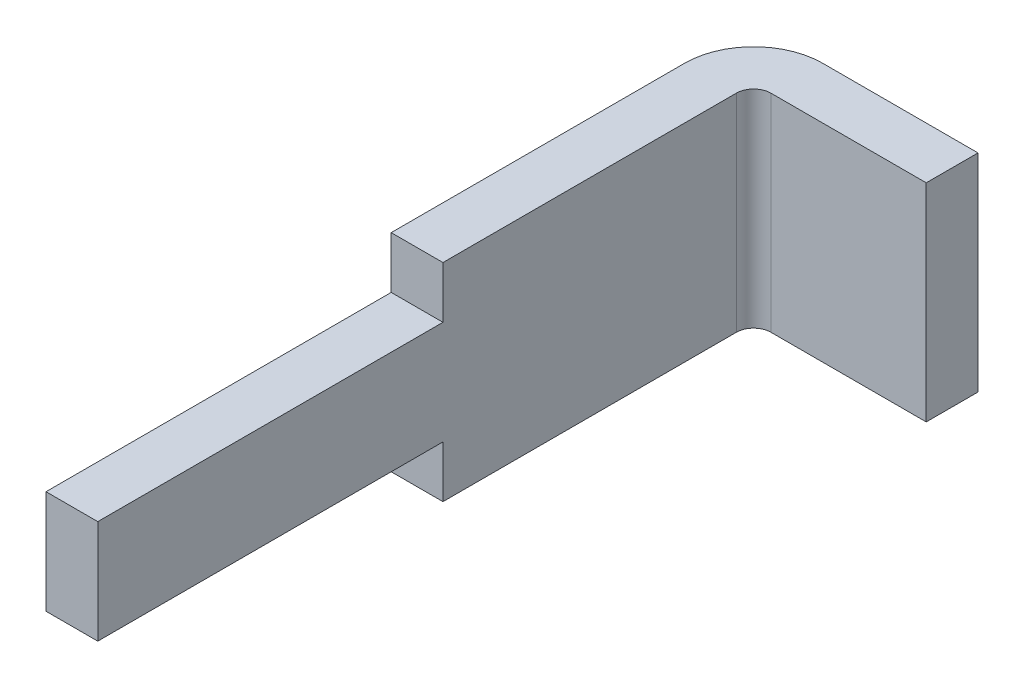
ISO-10303-21;
HEADER;
FILE_DESCRIPTION(('STEP AP214'),'2;1');
FILE_NAME('part.step','',(''),(''),'','','');
FILE_SCHEMA(('AUTOMOTIVE_DESIGN { 1 0 10303 214 1 1 1 1 }'));
ENDSEC;
DATA;
#1=APPLICATION_CONTEXT('core data for automotive mechanical design processes');
#2=APPLICATION_PROTOCOL_DEFINITION('international standard','automotive_design',2000,#1);
#3=PRODUCT_CONTEXT('',#1,'mechanical');
#4=PRODUCT('Part','Part','',(#3));
#5=PRODUCT_RELATED_PRODUCT_CATEGORY('part','',(#4));
#6=PRODUCT_DEFINITION_FORMATION('','',#4);
#7=PRODUCT_DEFINITION_CONTEXT('part definition',#1,'design');
#8=PRODUCT_DEFINITION('design','',#6,#7);
#9=PRODUCT_DEFINITION_SHAPE('','',#8);
#10=(LENGTH_UNIT() NAMED_UNIT(*) SI_UNIT(.MILLI.,.METRE.));
#11=(NAMED_UNIT(*) PLANE_ANGLE_UNIT() SI_UNIT($,.RADIAN.));
#12=(NAMED_UNIT(*) SI_UNIT($,.STERADIAN.) SOLID_ANGLE_UNIT());
#13=UNCERTAINTY_MEASURE_WITH_UNIT(LENGTH_MEASURE(1.E-05),#10,'distance_accuracy_value','');
#14=(GEOMETRIC_REPRESENTATION_CONTEXT(3) GLOBAL_UNCERTAINTY_ASSIGNED_CONTEXT((#13)) GLOBAL_UNIT_ASSIGNED_CONTEXT((#10,
#11,#12)) REPRESENTATION_CONTEXT('',''));
#15=CARTESIAN_POINT('',(0.,0.,0.));
#16=DIRECTION('',(0.,0.,1.));
#17=DIRECTION('',(1.,0.,0.));
#18=AXIS2_PLACEMENT_3D('',#15,#16,#17);
#19=CARTESIAN_POINT('',(-7.99341807917513,-21.1284458542384,-6.97073395253096));
#20=DIRECTION('',(0.,-1.,0.));
#21=DIRECTION('',(-1.,0.,0.));
#22=AXIS2_PLACEMENT_3D('',#19,#20,#21);
#23=PLANE('',#22);
#24=DIRECTION('',(-1.,0.,0.));
#25=VECTOR('',#24,1.);
#26=CARTESIAN_POINT('',(-6.8558844511499,-21.1284458542384,-8.02487550231057));
#27=LINE('',#26,#25);
#28=CARTESIAN_POINT('',(-6.8558844511499,-21.1284458542384,-8.02487550231057));
#29=VERTEX_POINT('',#28);
#30=CARTESIAN_POINT('',(-7.9988844511499,-21.1284458542384,-8.02487550231057));
#31=VERTEX_POINT('',#30);
#32=EDGE_CURVE('E28',#29,#31,#27,.T.);
#33=ORIENTED_EDGE('',*,*,#32,.T.);
#34=CARTESIAN_POINT('',(-7.9988844511499,-21.1284458542384,-7.51687550231057));
#35=DIRECTION('',(0.,1.,0.));
#36=DIRECTION('',(0.,0.,-1.));
#37=AXIS2_PLACEMENT_3D('',#34,#35,#36);
#38=CIRCLE('',#37,0.508);
#39=CARTESIAN_POINT('',(-8.5068844511499,-21.1284458542384,-7.51687550231057));
#40=VERTEX_POINT('',#39);
#41=EDGE_CURVE('E233',#31,#40,#38,.T.);
#42=ORIENTED_EDGE('',*,*,#41,.T.);
#43=DIRECTION('',(0.,0.,1.));
#44=VECTOR('',#43,1.);
#45=CARTESIAN_POINT('',(-8.5068844511499,-21.1284458542384,-7.51687550231057));
#46=LINE('',#45,#44);
#47=CARTESIAN_POINT('',(-8.5068844511499,-21.1284458542384,-5.35787550231057));
#48=VERTEX_POINT('',#47);
#49=EDGE_CURVE('E205',#40,#48,#46,.T.);
#50=ORIENTED_EDGE('',*,*,#49,.T.);
#51=DIRECTION('',(1.,0.,0.));
#52=VECTOR('',#51,1.);
#53=CARTESIAN_POINT('',(-8.5068844511499,-21.1284458542384,-5.35787550231057));
#54=LINE('',#53,#52);
#55=CARTESIAN_POINT('',(-8.1258844511499,-21.1284458542384,-5.35787550231057));
#56=VERTEX_POINT('',#55);
#57=EDGE_CURVE('E162',#48,#56,#54,.T.);
#58=ORIENTED_EDGE('',*,*,#57,.T.);
#59=DIRECTION('',(0.,0.,-1.));
#60=VECTOR('',#59,1.);
#61=CARTESIAN_POINT('',(-8.1258844511499,-21.1284458542384,-5.35787550231057));
#62=LINE('',#61,#60);
#63=CARTESIAN_POINT('',(-8.1258844511499,-21.1284458542384,-7.51687550231057));
#64=VERTEX_POINT('',#63);
#65=EDGE_CURVE('E188',#56,#64,#62,.T.);
#66=ORIENTED_EDGE('',*,*,#65,.T.);
#67=CARTESIAN_POINT('',(-7.9988844511499,-21.1284458542384,-7.51687550231057));
#68=DIRECTION('',(0.,-1.,0.));
#69=DIRECTION('',(0.,0.,1.));
#70=AXIS2_PLACEMENT_3D('',#67,#68,#69);
#71=CIRCLE('',#70,0.127);
#72=CARTESIAN_POINT('',(-7.9988844511499,-21.1284458542384,-7.64387550231057));
#73=VERTEX_POINT('',#72);
#74=EDGE_CURVE('E134',#64,#73,#71,.T.);
#75=ORIENTED_EDGE('',*,*,#74,.T.);
#76=DIRECTION('',(1.,0.,0.));
#77=VECTOR('',#76,1.);
#78=CARTESIAN_POINT('',(-7.9988844511499,-21.1284458542384,-7.64387550231057));
#79=LINE('',#78,#77);
#80=CARTESIAN_POINT('',(-6.8558844511499,-21.1284458542384,-7.64387550231057));
#81=VERTEX_POINT('',#80);
#82=EDGE_CURVE('E129',#73,#81,#79,.T.);
#83=ORIENTED_EDGE('',*,*,#82,.T.);
#84=DIRECTION('',(0.,0.,-1.));
#85=VECTOR('',#84,1.);
#86=CARTESIAN_POINT('',(-6.8558844511499,-21.1284458542384,-7.64387550231057));
#87=LINE('',#86,#85);
#88=EDGE_CURVE('E132',#81,#29,#87,.T.);
#89=ORIENTED_EDGE('',*,*,#88,.T.);
#90=EDGE_LOOP('',(#33,#42,#50,#58,#66,#75,#83,#89));
#91=FACE_BOUND('',#90,.T.);
#92=ADVANCED_FACE('F17',(#91),#23,.F.);
#93=CARTESIAN_POINT('',(-7.99341807917513,-22.6524458542384,-6.97073395253096));
#94=DIRECTION('',(0.,-1.,0.));
#95=DIRECTION('',(-1.,0.,0.));
#96=AXIS2_PLACEMENT_3D('',#93,#94,#95);
#97=PLANE('',#96);
#98=DIRECTION('',(-1.,0.,0.));
#99=VECTOR('',#98,1.);
#100=CARTESIAN_POINT('',(-6.8558844511499,-22.6524458542384,-8.02487550231057));
#101=LINE('',#100,#99);
#102=CARTESIAN_POINT('',(-6.8558844511499,-22.6524458542384,-8.02487550231057));
#103=VERTEX_POINT('',#102);
#104=CARTESIAN_POINT('',(-7.9988844511499,-22.6524458542384,-8.02487550231057));
#105=VERTEX_POINT('',#104);
#106=EDGE_CURVE('E11',#103,#105,#101,.T.);
#107=ORIENTED_EDGE('',*,*,#106,.F.);
#108=DIRECTION('',(0.,0.,-1.));
#109=VECTOR('',#108,1.);
#110=CARTESIAN_POINT('',(-6.8558844511499,-22.6524458542384,-7.64387550231057));
#111=LINE('',#110,#109);
#112=CARTESIAN_POINT('',(-6.8558844511499,-22.6524458542384,-7.64387550231057));
#113=VERTEX_POINT('',#112);
#114=EDGE_CURVE('E151',#113,#103,#111,.T.);
#115=ORIENTED_EDGE('',*,*,#114,.F.);
#116=DIRECTION('',(1.,0.,0.));
#117=VECTOR('',#116,1.);
#118=CARTESIAN_POINT('',(-7.9988844511499,-22.6524458542384,-7.64387550231057));
#119=LINE('',#118,#117);
#120=CARTESIAN_POINT('',(-7.9988844511499,-22.6524458542384,-7.64387550231057));
#121=VERTEX_POINT('',#120);
#122=EDGE_CURVE('E146',#121,#113,#119,.T.);
#123=ORIENTED_EDGE('',*,*,#122,.F.);
#124=CARTESIAN_POINT('',(-7.9988844511499,-22.6524458542384,-7.51687550231057));
#125=DIRECTION('',(0.,-1.,0.));
#126=DIRECTION('',(0.,0.,1.));
#127=AXIS2_PLACEMENT_3D('',#124,#125,#126);
#128=CIRCLE('',#127,0.127);
#129=CARTESIAN_POINT('',(-8.1258844511499,-22.6524458542384,-7.51687550231057));
#130=VERTEX_POINT('',#129);
#131=EDGE_CURVE('E166',#130,#121,#128,.T.);
#132=ORIENTED_EDGE('',*,*,#131,.F.);
#133=DIRECTION('',(0.,0.,-1.));
#134=VECTOR('',#133,1.);
#135=CARTESIAN_POINT('',(-8.1258844511499,-22.6524458542384,-5.35787550231057));
#136=LINE('',#135,#134);
#137=CARTESIAN_POINT('',(-8.1258844511499,-22.6524458542384,-5.35787550231057));
#138=VERTEX_POINT('',#137);
#139=EDGE_CURVE('E191',#138,#130,#136,.T.);
#140=ORIENTED_EDGE('',*,*,#139,.F.);
#141=DIRECTION('',(1.,0.,0.));
#142=VECTOR('',#141,1.);
#143=CARTESIAN_POINT('',(-8.5068844511499,-22.6524458542384,-5.35787550231057));
#144=LINE('',#143,#142);
#145=CARTESIAN_POINT('',(-8.5068844511499,-22.6524458542384,-5.35787550231057));
#146=VERTEX_POINT('',#145);
#147=EDGE_CURVE('E186',#146,#138,#144,.T.);
#148=ORIENTED_EDGE('',*,*,#147,.F.);
#149=DIRECTION('',(0.,0.,1.));
#150=VECTOR('',#149,1.);
#151=CARTESIAN_POINT('',(-8.5068844511499,-22.6524458542384,-7.51687550231057));
#152=LINE('',#151,#150);
#153=CARTESIAN_POINT('',(-8.5068844511499,-22.6524458542384,-7.51687550231057));
#154=VERTEX_POINT('',#153);
#155=EDGE_CURVE('E204',#154,#146,#152,.T.);
#156=ORIENTED_EDGE('',*,*,#155,.F.);
#157=CARTESIAN_POINT('',(-7.9988844511499,-22.6524458542384,-7.51687550231057));
#158=DIRECTION('',(0.,1.,0.));
#159=DIRECTION('',(0.,0.,-1.));
#160=AXIS2_PLACEMENT_3D('',#157,#158,#159);
#161=CIRCLE('',#160,0.508);
#162=EDGE_CURVE('E208',#105,#154,#161,.T.);
#163=ORIENTED_EDGE('',*,*,#162,.F.);
#164=EDGE_LOOP('',(#107,#115,#123,#132,#140,#148,#156,#163));
#165=FACE_BOUND('',#164,.T.);
#166=ADVANCED_FACE('F270',(#165),#97,.T.);
#167=CARTESIAN_POINT('',(-6.8558844511499,-21.1284458542384,-8.02487550231057));
#168=DIRECTION('',(0.,0.,1.));
#169=DIRECTION('',(1.,0.,0.));
#170=AXIS2_PLACEMENT_3D('',#167,#168,#169);
#171=PLANE('',#170);
#172=ORIENTED_EDGE('',*,*,#32,.F.);
#173=DIRECTION('',(0.,-1.,0.));
#174=VECTOR('',#173,1.);
#175=CARTESIAN_POINT('',(-6.8558844511499,-21.1284458542384,-8.02487550231057));
#176=LINE('',#175,#174);
#177=EDGE_CURVE('E140',#29,#103,#176,.T.);
#178=ORIENTED_EDGE('',*,*,#177,.T.);
#179=ORIENTED_EDGE('',*,*,#106,.T.);
#180=DIRECTION('',(0.,-1.,0.));
#181=VECTOR('',#180,1.);
#182=CARTESIAN_POINT('',(-7.9988844511499,-21.1284458542384,-8.02487550231057));
#183=LINE('',#182,#181);
#184=EDGE_CURVE('E236',#31,#105,#183,.T.);
#185=ORIENTED_EDGE('',*,*,#184,.F.);
#186=EDGE_LOOP('',(#172,#178,#179,#185));
#187=FACE_BOUND('',#186,.T.);
#188=ADVANCED_FACE('F272',(#187),#171,.F.);
#189=CARTESIAN_POINT('',(-7.9988844511499,-21.1284458542384,-7.51687550231057));
#190=DIRECTION('',(0.,1.,0.));
#191=DIRECTION('',(0.,0.,-1.));
#192=AXIS2_PLACEMENT_3D('',#189,#190,#191);
#193=CYLINDRICAL_SURFACE('',#192,0.508);
#194=ORIENTED_EDGE('',*,*,#41,.F.);
#195=ORIENTED_EDGE('',*,*,#184,.T.);
#196=ORIENTED_EDGE('',*,*,#162,.T.);
#197=DIRECTION('',(0.,-1.,0.));
#198=VECTOR('',#197,1.);
#199=CARTESIAN_POINT('',(-8.5068844511499,-21.1284458542384,-7.51687550231057));
#200=LINE('',#199,#198);
#201=EDGE_CURVE('E200',#40,#154,#200,.T.);
#202=ORIENTED_EDGE('',*,*,#201,.F.);
#203=EDGE_LOOP('',(#194,#195,#196,#202));
#204=FACE_BOUND('',#203,.T.);
#205=ADVANCED_FACE('F278',(#204),#193,.T.);
#206=CARTESIAN_POINT('',(-8.5068844511499,-21.1284458542384,-7.51687550231057));
#207=DIRECTION('',(1.,0.,0.));
#208=DIRECTION('',(0.,0.,-1.));
#209=AXIS2_PLACEMENT_3D('',#206,#207,#208);
#210=PLANE('',#209);
#211=ORIENTED_EDGE('',*,*,#49,.F.);
#212=ORIENTED_EDGE('',*,*,#201,.T.);
#213=ORIENTED_EDGE('',*,*,#155,.T.);
#214=DIRECTION('',(0.,-1.,0.));
#215=VECTOR('',#214,1.);
#216=CARTESIAN_POINT('',(-8.5068844511499,-21.1284458542384,-5.35787550231057));
#217=LINE('',#216,#215);
#218=CARTESIAN_POINT('',(-8.5068844511499,-22.2714458542384,-5.35787550231057));
#219=VERTEX_POINT('',#218);
#220=EDGE_CURVE('E182',#219,#146,#217,.T.);
#221=ORIENTED_EDGE('',*,*,#220,.F.);
#222=DIRECTION('',(0.,0.,-1.));
#223=VECTOR('',#222,1.);
#224=CARTESIAN_POINT('',(-8.5068844511499,-22.2714458542384,-2.81787550231057));
#225=LINE('',#224,#223);
#226=CARTESIAN_POINT('',(-8.5068844511499,-22.2714458542384,-2.81787550231057));
#227=VERTEX_POINT('',#226);
#228=EDGE_CURVE('E181',#227,#219,#225,.T.);
#229=ORIENTED_EDGE('',*,*,#228,.F.);
#230=DIRECTION('',(0.,-1.,0.));
#231=VECTOR('',#230,1.);
#232=CARTESIAN_POINT('',(-8.5068844511499,-21.5094458542384,-2.81787550231057));
#233=LINE('',#232,#231);
#234=CARTESIAN_POINT('',(-8.5068844511499,-21.5094458542384,-2.81787550231057));
#235=VERTEX_POINT('',#234);
#236=EDGE_CURVE('E187',#235,#227,#233,.T.);
#237=ORIENTED_EDGE('',*,*,#236,.F.);
#238=DIRECTION('',(0.,0.,1.));
#239=VECTOR('',#238,1.);
#240=CARTESIAN_POINT('',(-8.5068844511499,-21.5094458542384,-5.35787550231057));
#241=LINE('',#240,#239);
#242=CARTESIAN_POINT('',(-8.5068844511499,-21.5094458542384,-5.35787550231057));
#243=VERTEX_POINT('',#242);
#244=EDGE_CURVE('E168',#243,#235,#241,.T.);
#245=ORIENTED_EDGE('',*,*,#244,.F.);
#246=DIRECTION('',(0.,-1.,0.));
#247=VECTOR('',#246,1.);
#248=CARTESIAN_POINT('',(-8.5068844511499,-21.1284458542384,-5.35787550231057));
#249=LINE('',#248,#247);
#250=EDGE_CURVE('E156',#48,#243,#249,.T.);
#251=ORIENTED_EDGE('',*,*,#250,.F.);
#252=EDGE_LOOP('',(#211,#212,#213,#221,#229,#237,#245,#251));
#253=FACE_BOUND('',#252,.T.);
#254=ADVANCED_FACE('F19',(#253),#210,.F.);
#255=CARTESIAN_POINT('',(-8.1258844511499,-21.1284458542384,-5.35787550231057));
#256=DIRECTION('',(-1.,0.,0.));
#257=DIRECTION('',(0.,0.,1.));
#258=AXIS2_PLACEMENT_3D('',#255,#256,#257);
#259=PLANE('',#258);
#260=ORIENTED_EDGE('',*,*,#65,.F.);
#261=DIRECTION('',(0.,-1.,0.));
#262=VECTOR('',#261,1.);
#263=CARTESIAN_POINT('',(-8.1258844511499,-21.1284458542384,-5.35787550231057));
#264=LINE('',#263,#262);
#265=CARTESIAN_POINT('',(-8.1258844511499,-21.5094458542384,-5.35787550231057));
#266=VERTEX_POINT('',#265);
#267=EDGE_CURVE('E21',#56,#266,#264,.T.);
#268=ORIENTED_EDGE('',*,*,#267,.T.);
#269=DIRECTION('',(0.,0.,1.));
#270=VECTOR('',#269,1.);
#271=CARTESIAN_POINT('',(-8.1258844511499,-21.5094458542384,-3.45287550231057));
#272=LINE('',#271,#270);
#273=CARTESIAN_POINT('',(-8.1258844511499,-21.5094458542384,-2.81787550231057));
#274=VERTEX_POINT('',#273);
#275=EDGE_CURVE('E213',#266,#274,#272,.T.);
#276=ORIENTED_EDGE('',*,*,#275,.T.);
#277=DIRECTION('',(0.,-1.,0.));
#278=VECTOR('',#277,1.);
#279=CARTESIAN_POINT('',(-8.1258844511499,-22.0809458542384,-2.81787550231057));
#280=LINE('',#279,#278);
#281=CARTESIAN_POINT('',(-8.1258844511499,-22.2714458542384,-2.81787550231057));
#282=VERTEX_POINT('',#281);
#283=EDGE_CURVE('E248',#274,#282,#280,.T.);
#284=ORIENTED_EDGE('',*,*,#283,.T.);
#285=DIRECTION('',(0.,0.,-1.));
#286=VECTOR('',#285,1.);
#287=CARTESIAN_POINT('',(-8.1258844511499,-22.2714458542384,-4.72287550231057));
#288=LINE('',#287,#286);
#289=CARTESIAN_POINT('',(-8.1258844511499,-22.2714458542384,-5.35787550231057));
#290=VERTEX_POINT('',#289);
#291=EDGE_CURVE('E173',#282,#290,#288,.T.);
#292=ORIENTED_EDGE('',*,*,#291,.T.);
#293=DIRECTION('',(0.,-1.,0.));
#294=VECTOR('',#293,1.);
#295=CARTESIAN_POINT('',(-8.1258844511499,-21.1284458542384,-5.35787550231057));
#296=LINE('',#295,#294);
#297=EDGE_CURVE('E231',#290,#138,#296,.T.);
#298=ORIENTED_EDGE('',*,*,#297,.T.);
#299=ORIENTED_EDGE('',*,*,#139,.T.);
#300=DIRECTION('',(0.,-1.,0.));
#301=VECTOR('',#300,1.);
#302=CARTESIAN_POINT('',(-8.1258844511499,-21.1284458542384,-7.51687550231057));
#303=LINE('',#302,#301);
#304=EDGE_CURVE('E251',#64,#130,#303,.T.);
#305=ORIENTED_EDGE('',*,*,#304,.F.);
#306=EDGE_LOOP('',(#260,#268,#276,#284,#292,#298,#299,#305));
#307=FACE_BOUND('',#306,.T.);
#308=ADVANCED_FACE('F285',(#307),#259,.F.);
#309=CARTESIAN_POINT('',(-7.9988844511499,-21.1284458542384,-7.51687550231057));
#310=DIRECTION('',(0.,1.,0.));
#311=DIRECTION('',(0.,0.,1.));
#312=AXIS2_PLACEMENT_3D('',#309,#310,#311);
#313=CYLINDRICAL_SURFACE('',#312,0.127);
#314=ORIENTED_EDGE('',*,*,#74,.F.);
#315=ORIENTED_EDGE('',*,*,#304,.T.);
#316=ORIENTED_EDGE('',*,*,#131,.T.);
#317=DIRECTION('',(0.,-1.,0.));
#318=VECTOR('',#317,1.);
#319=CARTESIAN_POINT('',(-7.9988844511499,-21.1284458542384,-7.64387550231057));
#320=LINE('',#319,#318);
#321=EDGE_CURVE('E139',#73,#121,#320,.T.);
#322=ORIENTED_EDGE('',*,*,#321,.F.);
#323=EDGE_LOOP('',(#314,#315,#316,#322));
#324=FACE_BOUND('',#323,.T.);
#325=ADVANCED_FACE('F268',(#324),#313,.F.);
#326=CARTESIAN_POINT('',(-7.9988844511499,-21.1284458542384,-7.64387550231057));
#327=DIRECTION('',(0.,0.,-1.));
#328=DIRECTION('',(-1.,0.,0.));
#329=AXIS2_PLACEMENT_3D('',#326,#327,#328);
#330=PLANE('',#329);
#331=ORIENTED_EDGE('',*,*,#82,.F.);
#332=ORIENTED_EDGE('',*,*,#321,.T.);
#333=ORIENTED_EDGE('',*,*,#122,.T.);
#334=DIRECTION('',(0.,-1.,0.));
#335=VECTOR('',#334,1.);
#336=CARTESIAN_POINT('',(-6.8558844511499,-21.1284458542384,-7.64387550231057));
#337=LINE('',#336,#335);
#338=EDGE_CURVE('E143',#81,#113,#337,.T.);
#339=ORIENTED_EDGE('',*,*,#338,.F.);
#340=EDGE_LOOP('',(#331,#332,#333,#339));
#341=FACE_BOUND('',#340,.T.);
#342=ADVANCED_FACE('F144',(#341),#330,.F.);
#343=CARTESIAN_POINT('',(-6.8558844511499,-21.1284458542384,-7.64387550231057));
#344=DIRECTION('',(-1.,0.,0.));
#345=DIRECTION('',(0.,0.,1.));
#346=AXIS2_PLACEMENT_3D('',#343,#344,#345);
#347=PLANE('',#346);
#348=ORIENTED_EDGE('',*,*,#88,.F.);
#349=ORIENTED_EDGE('',*,*,#338,.T.);
#350=ORIENTED_EDGE('',*,*,#114,.T.);
#351=ORIENTED_EDGE('',*,*,#177,.F.);
#352=EDGE_LOOP('',(#348,#349,#350,#351));
#353=FACE_BOUND('',#352,.T.);
#354=ADVANCED_FACE('F154',(#353),#347,.F.);
#355=CARTESIAN_POINT('',(-8.5068844511499,-21.1284458542384,-5.35787550231057));
#356=DIRECTION('',(0.,0.,-1.));
#357=DIRECTION('',(0.,-1.,0.));
#358=AXIS2_PLACEMENT_3D('',#355,#356,#357);
#359=PLANE('',#358);
#360=DIRECTION('',(-1.,0.,0.));
#361=VECTOR('',#360,1.);
#362=CARTESIAN_POINT('',(-8.5068844511499,-21.5094458542384,-5.35787550231057));
#363=LINE('',#362,#361);
#364=EDGE_CURVE('E171',#266,#243,#363,.T.);
#365=ORIENTED_EDGE('',*,*,#364,.F.);
#366=ORIENTED_EDGE('',*,*,#267,.F.);
#367=ORIENTED_EDGE('',*,*,#57,.F.);
#368=ORIENTED_EDGE('',*,*,#250,.T.);
#369=EDGE_LOOP('',(#365,#366,#367,#368));
#370=FACE_BOUND('',#369,.T.);
#371=ADVANCED_FACE('F284',(#370),#359,.F.);
#372=CARTESIAN_POINT('',(-8.5068844511499,-21.1284458542384,-5.35787550231057));
#373=DIRECTION('',(0.,0.,-1.));
#374=DIRECTION('',(0.,-1.,0.));
#375=AXIS2_PLACEMENT_3D('',#372,#373,#374);
#376=PLANE('',#375);
#377=DIRECTION('',(1.,0.,0.));
#378=VECTOR('',#377,1.);
#379=CARTESIAN_POINT('',(-8.5068844511499,-22.2714458542384,-5.35787550231057));
#380=LINE('',#379,#378);
#381=EDGE_CURVE('E199',#219,#290,#380,.T.);
#382=ORIENTED_EDGE('',*,*,#381,.F.);
#383=ORIENTED_EDGE('',*,*,#220,.T.);
#384=ORIENTED_EDGE('',*,*,#147,.T.);
#385=ORIENTED_EDGE('',*,*,#297,.F.);
#386=EDGE_LOOP('',(#382,#383,#384,#385));
#387=FACE_BOUND('',#386,.T.);
#388=ADVANCED_FACE('F290',(#387),#376,.F.);
#389=CARTESIAN_POINT('',(-8.5068844511499,-22.2714458542384,-2.81787550231057));
#390=DIRECTION('',(0.,0.,-1.));
#391=DIRECTION('',(-1.,0.,0.));
#392=AXIS2_PLACEMENT_3D('',#389,#390,#391);
#393=PLANE('',#392);
#394=ORIENTED_EDGE('',*,*,#283,.F.);
#395=DIRECTION('',(1.,0.,0.));
#396=VECTOR('',#395,1.);
#397=CARTESIAN_POINT('',(-8.5068844511499,-21.5094458542384,-2.81787550231057));
#398=LINE('',#397,#396);
#399=EDGE_CURVE('E170',#235,#274,#398,.T.);
#400=ORIENTED_EDGE('',*,*,#399,.F.);
#401=ORIENTED_EDGE('',*,*,#236,.T.);
#402=DIRECTION('',(1.,0.,0.));
#403=VECTOR('',#402,1.);
#404=CARTESIAN_POINT('',(-8.5068844511499,-22.2714458542384,-2.81787550231057));
#405=LINE('',#404,#403);
#406=EDGE_CURVE('E177',#227,#282,#405,.T.);
#407=ORIENTED_EDGE('',*,*,#406,.T.);
#408=EDGE_LOOP('',(#394,#400,#401,#407));
#409=FACE_BOUND('',#408,.T.);
#410=ADVANCED_FACE('F298',(#409),#393,.F.);
#411=CARTESIAN_POINT('',(-8.5068844511499,-21.5094458542384,-2.81787550231057));
#412=DIRECTION('',(0.,-1.,0.));
#413=DIRECTION('',(0.,0.,-1.));
#414=AXIS2_PLACEMENT_3D('',#411,#412,#413);
#415=PLANE('',#414);
#416=ORIENTED_EDGE('',*,*,#275,.F.);
#417=ORIENTED_EDGE('',*,*,#364,.T.);
#418=ORIENTED_EDGE('',*,*,#244,.T.);
#419=ORIENTED_EDGE('',*,*,#399,.T.);
#420=EDGE_LOOP('',(#416,#417,#418,#419));
#421=FACE_BOUND('',#420,.T.);
#422=ADVANCED_FACE('F302',(#421),#415,.F.);
#423=CARTESIAN_POINT('',(-8.5068844511499,-22.2714458542384,-5.35787550231057));
#424=DIRECTION('',(0.,1.,0.));
#425=DIRECTION('',(0.,0.,-1.));
#426=AXIS2_PLACEMENT_3D('',#423,#424,#425);
#427=PLANE('',#426);
#428=ORIENTED_EDGE('',*,*,#291,.F.);
#429=ORIENTED_EDGE('',*,*,#406,.F.);
#430=ORIENTED_EDGE('',*,*,#228,.T.);
#431=ORIENTED_EDGE('',*,*,#381,.T.);
#432=EDGE_LOOP('',(#428,#429,#430,#431));
#433=FACE_BOUND('',#432,.T.);
#434=ADVANCED_FACE('F296',(#433),#427,.F.);
#435=CLOSED_SHELL('',(#92,#166,#188,#205,#254,#308,#325,#342,#354,#371,#388,#410,#422,#434));
#436=MANIFOLD_SOLID_BREP('B1',#435);
#437=ADVANCED_BREP_SHAPE_REPRESENTATION('',(#18,#436),#14);
#438=SHAPE_DEFINITION_REPRESENTATION(#9,#437);
ENDSEC;
END-ISO-10303-21;
